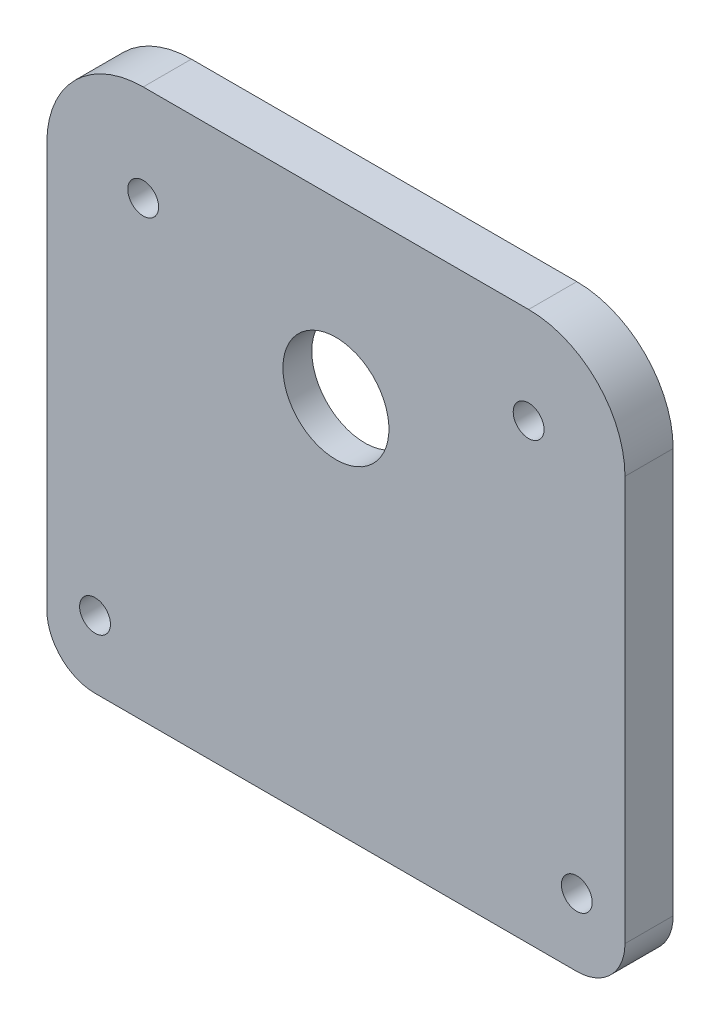
ISO-10303-21;
HEADER;
FILE_DESCRIPTION(('STEP AP214'),'2;1');
FILE_NAME('part.step','',(''),(''),'','','');
FILE_SCHEMA(('AUTOMOTIVE_DESIGN { 1 0 10303 214 1 1 1 1 }'));
ENDSEC;
DATA;
#1=APPLICATION_CONTEXT('core data for automotive mechanical design processes');
#2=APPLICATION_PROTOCOL_DEFINITION('international standard','automotive_design',2000,#1);
#3=PRODUCT_CONTEXT('',#1,'mechanical');
#4=PRODUCT('Part','Part','',(#3));
#5=PRODUCT_RELATED_PRODUCT_CATEGORY('part','',(#4));
#6=PRODUCT_DEFINITION_FORMATION('','',#4);
#7=PRODUCT_DEFINITION_CONTEXT('part definition',#1,'design');
#8=PRODUCT_DEFINITION('design','',#6,#7);
#9=PRODUCT_DEFINITION_SHAPE('','',#8);
#10=(LENGTH_UNIT() NAMED_UNIT(*) SI_UNIT(.MILLI.,.METRE.));
#11=(NAMED_UNIT(*) PLANE_ANGLE_UNIT() SI_UNIT($,.RADIAN.));
#12=(NAMED_UNIT(*) SI_UNIT($,.STERADIAN.) SOLID_ANGLE_UNIT());
#13=UNCERTAINTY_MEASURE_WITH_UNIT(LENGTH_MEASURE(1.E-05),#10,'distance_accuracy_value','');
#14=(GEOMETRIC_REPRESENTATION_CONTEXT(3) GLOBAL_UNCERTAINTY_ASSIGNED_CONTEXT((#13)) GLOBAL_UNIT_ASSIGNED_CONTEXT((#10,
#11,#12)) REPRESENTATION_CONTEXT('',''));
#15=CARTESIAN_POINT('',(0.,0.,0.));
#16=DIRECTION('',(0.,0.,1.));
#17=DIRECTION('',(1.,0.,0.));
#18=AXIS2_PLACEMENT_3D('',#15,#16,#17);
#19=CARTESIAN_POINT('',(0.,0.,5.));
#20=DIRECTION('',(0.,0.,-1.));
#21=DIRECTION('',(-1.,0.,0.));
#22=AXIS2_PLACEMENT_3D('',#19,#20,#21);
#23=PLANE('',#22);
#24=DIRECTION('',(1.,0.,0.));
#25=VECTOR('',#24,1.);
#26=CARTESIAN_POINT('',(0.,32.,5.));
#27=LINE('',#26,#25);
#28=CARTESIAN_POINT('',(-20.,32.,5.));
#29=VERTEX_POINT('',#28);
#30=CARTESIAN_POINT('',(20.,32.,5.));
#31=VERTEX_POINT('',#30);
#32=EDGE_CURVE('E186',#29,#31,#27,.T.);
#33=ORIENTED_EDGE('',*,*,#32,.T.);
#34=CARTESIAN_POINT('',(20.,22.,5.));
#35=DIRECTION('',(0.,0.,-1.));
#36=DIRECTION('',(-1.,0.,0.));
#37=AXIS2_PLACEMENT_3D('',#34,#35,#36);
#38=CIRCLE('',#37,10.);
#39=CARTESIAN_POINT('',(30.,22.,5.));
#40=VERTEX_POINT('',#39);
#41=EDGE_CURVE('E188',#40,#31,#38,.F.);
#42=ORIENTED_EDGE('',*,*,#41,.F.);
#43=DIRECTION('',(0.,-1.,0.));
#44=VECTOR('',#43,1.);
#45=CARTESIAN_POINT('',(30.,-25.,5.));
#46=LINE('',#45,#44);
#47=CARTESIAN_POINT('',(30.,-20.,5.));
#48=VERTEX_POINT('',#47);
#49=EDGE_CURVE('E62',#40,#48,#46,.T.);
#50=ORIENTED_EDGE('',*,*,#49,.T.);
#51=CARTESIAN_POINT('',(25.,-20.,5.));
#52=DIRECTION('',(0.,0.,-1.));
#53=DIRECTION('',(-1.,0.,0.));
#54=AXIS2_PLACEMENT_3D('',#51,#52,#53);
#55=CIRCLE('',#54,5.);
#56=CARTESIAN_POINT('',(25.,-25.,5.));
#57=VERTEX_POINT('',#56);
#58=EDGE_CURVE('E11',#57,#48,#55,.F.);
#59=ORIENTED_EDGE('',*,*,#58,.F.);
#60=DIRECTION('',(-1.,0.,0.));
#61=VECTOR('',#60,1.);
#62=CARTESIAN_POINT('',(-30.,-25.,5.));
#63=LINE('',#62,#61);
#64=CARTESIAN_POINT('',(-25.,-25.,5.));
#65=VERTEX_POINT('',#64);
#66=EDGE_CURVE('E111',#57,#65,#63,.T.);
#67=ORIENTED_EDGE('',*,*,#66,.T.);
#68=CARTESIAN_POINT('',(-25.,-20.,5.));
#69=DIRECTION('',(0.,0.,-1.));
#70=DIRECTION('',(-1.,0.,0.));
#71=AXIS2_PLACEMENT_3D('',#68,#69,#70);
#72=CIRCLE('',#71,5.);
#73=CARTESIAN_POINT('',(-30.,-20.,5.));
#74=VERTEX_POINT('',#73);
#75=EDGE_CURVE('E191',#74,#65,#72,.F.);
#76=ORIENTED_EDGE('',*,*,#75,.F.);
#77=DIRECTION('',(0.,1.,0.));
#78=VECTOR('',#77,1.);
#79=CARTESIAN_POINT('',(-30.,-25.,5.));
#80=LINE('',#79,#78);
#81=CARTESIAN_POINT('',(-30.,22.,5.));
#82=VERTEX_POINT('',#81);
#83=EDGE_CURVE('E184',#74,#82,#80,.T.);
#84=ORIENTED_EDGE('',*,*,#83,.T.);
#85=CARTESIAN_POINT('',(-20.,22.,5.));
#86=DIRECTION('',(0.,0.,-1.));
#87=DIRECTION('',(-1.,0.,0.));
#88=AXIS2_PLACEMENT_3D('',#85,#86,#87);
#89=CIRCLE('',#88,10.);
#90=EDGE_CURVE('E181',#29,#82,#89,.F.);
#91=ORIENTED_EDGE('',*,*,#90,.F.);
#92=EDGE_LOOP('',(#33,#42,#50,#59,#67,#76,#84,#91));
#93=FACE_BOUND('',#92,.T.);
#94=CARTESIAN_POINT('',(-25.,-18.0000000000003,5.));
#95=DIRECTION('',(0.,0.,-1.));
#96=DIRECTION('',(-1.,0.,0.));
#97=AXIS2_PLACEMENT_3D('',#94,#95,#96);
#98=CIRCLE('',#97,1.6);
#99=CARTESIAN_POINT('',(-26.6,-18.0000000000003,5.));
#100=VERTEX_POINT('',#99);
#101=EDGE_CURVE('E178',#100,#100,#98,.F.);
#102=ORIENTED_EDGE('',*,*,#101,.T.);
#103=EDGE_LOOP('',(#102));
#104=FACE_BOUND('',#103,.T.);
#105=CARTESIAN_POINT('',(-20.0000000000001,22.,5.));
#106=DIRECTION('',(0.,0.,-1.));
#107=DIRECTION('',(-1.,0.,0.));
#108=AXIS2_PLACEMENT_3D('',#105,#106,#107);
#109=CIRCLE('',#108,1.6);
#110=CARTESIAN_POINT('',(-21.6000000000001,22.,5.));
#111=VERTEX_POINT('',#110);
#112=EDGE_CURVE('E175',#111,#111,#109,.F.);
#113=ORIENTED_EDGE('',*,*,#112,.T.);
#114=EDGE_LOOP('',(#113));
#115=FACE_BOUND('',#114,.T.);
#116=CARTESIAN_POINT('',(25.,-18.,5.));
#117=DIRECTION('',(0.,0.,-1.));
#118=DIRECTION('',(-1.,0.,0.));
#119=AXIS2_PLACEMENT_3D('',#116,#117,#118);
#120=CIRCLE('',#119,1.6);
#121=CARTESIAN_POINT('',(23.4,-18.,5.));
#122=VERTEX_POINT('',#121);
#123=EDGE_CURVE('E172',#122,#122,#120,.F.);
#124=ORIENTED_EDGE('',*,*,#123,.T.);
#125=EDGE_LOOP('',(#124));
#126=FACE_BOUND('',#125,.T.);
#127=CARTESIAN_POINT('',(19.9999999999999,22.0000000000002,5.));
#128=DIRECTION('',(0.,0.,-1.));
#129=DIRECTION('',(-1.,0.,0.));
#130=AXIS2_PLACEMENT_3D('',#127,#128,#129);
#131=CIRCLE('',#130,1.6);
#132=CARTESIAN_POINT('',(18.3999999999999,22.0000000000002,5.));
#133=VERTEX_POINT('',#132);
#134=EDGE_CURVE('E169',#133,#133,#131,.F.);
#135=ORIENTED_EDGE('',*,*,#134,.T.);
#136=EDGE_LOOP('',(#135));
#137=FACE_BOUND('',#136,.T.);
#138=CARTESIAN_POINT('',(0.,14.,5.));
#139=DIRECTION('',(0.,0.,-1.));
#140=DIRECTION('',(-1.,0.,0.));
#141=AXIS2_PLACEMENT_3D('',#138,#139,#140);
#142=CIRCLE('',#141,15.);
#143=CARTESIAN_POINT('',(-15.,14.,5.));
#144=VERTEX_POINT('',#143);
#145=EDGE_CURVE('E194',#144,#144,#142,.T.);
#146=ORIENTED_EDGE('',*,*,#145,.F.);
#147=EDGE_LOOP('',(#146));
#148=FACE_BOUND('',#147,.T.);
#149=ADVANCED_FACE('F47',(#93,#104,#115,#126,#137,#148),#23,.T.);
#150=CARTESIAN_POINT('',(30.,-25.,5.));
#151=DIRECTION('',(-1.,0.,0.));
#152=DIRECTION('',(0.,0.,1.));
#153=AXIS2_PLACEMENT_3D('',#150,#151,#152);
#154=PLANE('',#153);
#155=ORIENTED_EDGE('',*,*,#49,.F.);
#156=DIRECTION('',(0.,0.,-1.));
#157=VECTOR('',#156,1.);
#158=CARTESIAN_POINT('',(30.,22.,5.));
#159=LINE('',#158,#157);
#160=CARTESIAN_POINT('',(30.,22.,10.));
#161=VERTEX_POINT('',#160);
#162=EDGE_CURVE('E134',#40,#161,#159,.F.);
#163=ORIENTED_EDGE('',*,*,#162,.T.);
#164=DIRECTION('',(0.,1.,0.));
#165=VECTOR('',#164,1.);
#166=CARTESIAN_POINT('',(30.,-25.,10.));
#167=LINE('',#166,#165);
#168=CARTESIAN_POINT('',(30.,-20.,10.));
#169=VERTEX_POINT('',#168);
#170=EDGE_CURVE('E151',#169,#161,#167,.T.);
#171=ORIENTED_EDGE('',*,*,#170,.F.);
#172=DIRECTION('',(0.,0.,-1.));
#173=VECTOR('',#172,1.);
#174=CARTESIAN_POINT('',(30.,-20.,5.));
#175=LINE('',#174,#173);
#176=EDGE_CURVE('E123',#169,#48,#175,.T.);
#177=ORIENTED_EDGE('',*,*,#176,.T.);
#178=EDGE_LOOP('',(#155,#163,#171,#177));
#179=FACE_BOUND('',#178,.T.);
#180=ADVANCED_FACE('F229',(#179),#154,.F.);
#181=CARTESIAN_POINT('',(-30.,-25.,5.));
#182=DIRECTION('',(1.,0.,0.));
#183=DIRECTION('',(0.,0.,-1.));
#184=AXIS2_PLACEMENT_3D('',#181,#182,#183);
#185=PLANE('',#184);
#186=ORIENTED_EDGE('',*,*,#83,.F.);
#187=DIRECTION('',(0.,0.,-1.));
#188=VECTOR('',#187,1.);
#189=CARTESIAN_POINT('',(-30.,-20.,5.));
#190=LINE('',#189,#188);
#191=CARTESIAN_POINT('',(-30.,-20.,10.));
#192=VERTEX_POINT('',#191);
#193=EDGE_CURVE('E129',#74,#192,#190,.F.);
#194=ORIENTED_EDGE('',*,*,#193,.T.);
#195=DIRECTION('',(0.,-1.,0.));
#196=VECTOR('',#195,1.);
#197=CARTESIAN_POINT('',(-30.,-25.,10.));
#198=LINE('',#197,#196);
#199=CARTESIAN_POINT('',(-30.,22.,10.));
#200=VERTEX_POINT('',#199);
#201=EDGE_CURVE('E148',#200,#192,#198,.T.);
#202=ORIENTED_EDGE('',*,*,#201,.F.);
#203=DIRECTION('',(0.,0.,1.));
#204=VECTOR('',#203,1.);
#205=CARTESIAN_POINT('',(-30.,22.,5.));
#206=LINE('',#205,#204);
#207=EDGE_CURVE('E139',#200,#82,#206,.F.);
#208=ORIENTED_EDGE('',*,*,#207,.T.);
#209=EDGE_LOOP('',(#186,#194,#202,#208));
#210=FACE_BOUND('',#209,.T.);
#211=ADVANCED_FACE('F234',(#210),#185,.F.);
#212=CARTESIAN_POINT('',(-30.,-25.,5.));
#213=DIRECTION('',(0.,1.,0.));
#214=DIRECTION('',(0.,0.,1.));
#215=AXIS2_PLACEMENT_3D('',#212,#213,#214);
#216=PLANE('',#215);
#217=ORIENTED_EDGE('',*,*,#66,.F.);
#218=DIRECTION('',(0.,0.,-1.));
#219=VECTOR('',#218,1.);
#220=CARTESIAN_POINT('',(25.,-25.,5.));
#221=LINE('',#220,#219);
#222=CARTESIAN_POINT('',(25.,-25.,10.));
#223=VERTEX_POINT('',#222);
#224=EDGE_CURVE('E69',#57,#223,#221,.F.);
#225=ORIENTED_EDGE('',*,*,#224,.T.);
#226=DIRECTION('',(1.,0.,0.));
#227=VECTOR('',#226,1.);
#228=CARTESIAN_POINT('',(-30.,-25.,10.));
#229=LINE('',#228,#227);
#230=CARTESIAN_POINT('',(-25.,-25.,10.));
#231=VERTEX_POINT('',#230);
#232=EDGE_CURVE('E146',#231,#223,#229,.T.);
#233=ORIENTED_EDGE('',*,*,#232,.F.);
#234=DIRECTION('',(0.,0.,-1.));
#235=VECTOR('',#234,1.);
#236=CARTESIAN_POINT('',(-25.,-25.,5.));
#237=LINE('',#236,#235);
#238=EDGE_CURVE('E119',#231,#65,#237,.T.);
#239=ORIENTED_EDGE('',*,*,#238,.T.);
#240=EDGE_LOOP('',(#217,#225,#233,#239));
#241=FACE_BOUND('',#240,.T.);
#242=ADVANCED_FACE('F117',(#241),#216,.F.);
#243=CARTESIAN_POINT('',(19.9999999999999,22.0000000000002,10.));
#244=DIRECTION('',(0.,0.,-1.));
#245=DIRECTION('',(-1.,0.,0.));
#246=AXIS2_PLACEMENT_3D('',#243,#244,#245);
#247=CYLINDRICAL_SURFACE('',#246,1.6);
#248=CARTESIAN_POINT('',(19.9999999999999,22.0000000000002,10.));
#249=DIRECTION('',(0.,0.,-1.));
#250=DIRECTION('',(-1.,0.,0.));
#251=AXIS2_PLACEMENT_3D('',#248,#249,#250);
#252=CIRCLE('',#251,1.6);
#253=CARTESIAN_POINT('',(18.3999999999999,22.0000000000002,10.));
#254=VERTEX_POINT('',#253);
#255=EDGE_CURVE('E154',#254,#254,#252,.T.);
#256=ORIENTED_EDGE('',*,*,#255,.F.);
#257=EDGE_LOOP('',(#256));
#258=FACE_BOUND('',#257,.T.);
#259=ORIENTED_EDGE('',*,*,#134,.F.);
#260=EDGE_LOOP('',(#259));
#261=FACE_BOUND('',#260,.T.);
#262=ADVANCED_FACE('F241',(#258,#261),#247,.F.);
#263=CARTESIAN_POINT('',(25.,-18.,10.));
#264=DIRECTION('',(0.,0.,-1.));
#265=DIRECTION('',(-1.,0.,0.));
#266=AXIS2_PLACEMENT_3D('',#263,#264,#265);
#267=CYLINDRICAL_SURFACE('',#266,1.6);
#268=CARTESIAN_POINT('',(25.,-18.,10.));
#269=DIRECTION('',(0.,0.,-1.));
#270=DIRECTION('',(-1.,0.,0.));
#271=AXIS2_PLACEMENT_3D('',#268,#269,#270);
#272=CIRCLE('',#271,1.6);
#273=CARTESIAN_POINT('',(23.4,-18.,10.));
#274=VERTEX_POINT('',#273);
#275=EDGE_CURVE('E157',#274,#274,#272,.T.);
#276=ORIENTED_EDGE('',*,*,#275,.F.);
#277=EDGE_LOOP('',(#276));
#278=FACE_BOUND('',#277,.T.);
#279=ORIENTED_EDGE('',*,*,#123,.F.);
#280=EDGE_LOOP('',(#279));
#281=FACE_BOUND('',#280,.T.);
#282=ADVANCED_FACE('F283',(#278,#281),#267,.F.);
#283=CARTESIAN_POINT('',(-20.0000000000001,22.,10.));
#284=DIRECTION('',(0.,0.,-1.));
#285=DIRECTION('',(-1.,0.,0.));
#286=AXIS2_PLACEMENT_3D('',#283,#284,#285);
#287=CYLINDRICAL_SURFACE('',#286,1.6);
#288=CARTESIAN_POINT('',(-20.0000000000001,22.,10.));
#289=DIRECTION('',(0.,0.,-1.));
#290=DIRECTION('',(-1.,0.,0.));
#291=AXIS2_PLACEMENT_3D('',#288,#289,#290);
#292=CIRCLE('',#291,1.6);
#293=CARTESIAN_POINT('',(-21.6000000000001,22.,10.));
#294=VERTEX_POINT('',#293);
#295=EDGE_CURVE('E161',#294,#294,#292,.T.);
#296=ORIENTED_EDGE('',*,*,#295,.F.);
#297=EDGE_LOOP('',(#296));
#298=FACE_BOUND('',#297,.T.);
#299=ORIENTED_EDGE('',*,*,#112,.F.);
#300=EDGE_LOOP('',(#299));
#301=FACE_BOUND('',#300,.T.);
#302=ADVANCED_FACE('F279',(#298,#301),#287,.F.);
#303=CARTESIAN_POINT('',(-25.,-18.0000000000003,10.));
#304=DIRECTION('',(0.,0.,-1.));
#305=DIRECTION('',(-1.,0.,0.));
#306=AXIS2_PLACEMENT_3D('',#303,#304,#305);
#307=CYLINDRICAL_SURFACE('',#306,1.6);
#308=CARTESIAN_POINT('',(-25.,-18.0000000000003,10.));
#309=DIRECTION('',(0.,0.,-1.));
#310=DIRECTION('',(-1.,0.,0.));
#311=AXIS2_PLACEMENT_3D('',#308,#309,#310);
#312=CIRCLE('',#311,1.6);
#313=CARTESIAN_POINT('',(-26.6,-18.0000000000003,10.));
#314=VERTEX_POINT('',#313);
#315=EDGE_CURVE('E158',#314,#314,#312,.T.);
#316=ORIENTED_EDGE('',*,*,#315,.F.);
#317=EDGE_LOOP('',(#316));
#318=FACE_BOUND('',#317,.T.);
#319=ORIENTED_EDGE('',*,*,#101,.F.);
#320=EDGE_LOOP('',(#319));
#321=FACE_BOUND('',#320,.T.);
#322=ADVANCED_FACE('F275',(#318,#321),#307,.F.);
#323=CARTESIAN_POINT('',(0.,32.,0.));
#324=DIRECTION('',(0.,-1.,0.));
#325=DIRECTION('',(0.,0.,-1.));
#326=AXIS2_PLACEMENT_3D('',#323,#324,#325);
#327=PLANE('',#326);
#328=ORIENTED_EDGE('',*,*,#32,.F.);
#329=DIRECTION('',(0.,0.,1.));
#330=VECTOR('',#329,1.);
#331=CARTESIAN_POINT('',(-20.,32.,0.));
#332=LINE('',#331,#330);
#333=CARTESIAN_POINT('',(-20.,32.,10.));
#334=VERTEX_POINT('',#333);
#335=EDGE_CURVE('E144',#29,#334,#332,.T.);
#336=ORIENTED_EDGE('',*,*,#335,.T.);
#337=DIRECTION('',(1.,0.,0.));
#338=VECTOR('',#337,1.);
#339=CARTESIAN_POINT('',(-30.,32.,10.));
#340=LINE('',#339,#338);
#341=CARTESIAN_POINT('',(20.,32.,10.));
#342=VERTEX_POINT('',#341);
#343=EDGE_CURVE('E162',#334,#342,#340,.T.);
#344=ORIENTED_EDGE('',*,*,#343,.T.);
#345=DIRECTION('',(0.,0.,-1.));
#346=VECTOR('',#345,1.);
#347=CARTESIAN_POINT('',(20.,32.,0.));
#348=LINE('',#347,#346);
#349=EDGE_CURVE('E136',#342,#31,#348,.T.);
#350=ORIENTED_EDGE('',*,*,#349,.T.);
#351=EDGE_LOOP('',(#328,#336,#344,#350));
#352=FACE_BOUND('',#351,.T.);
#353=ADVANCED_FACE('F249',(#352),#327,.F.);
#354=CARTESIAN_POINT('',(-20.,22.,0.));
#355=DIRECTION('',(0.,0.,1.));
#356=DIRECTION('',(1.,0.,0.));
#357=AXIS2_PLACEMENT_3D('',#354,#355,#356);
#358=CYLINDRICAL_SURFACE('',#357,10.);
#359=ORIENTED_EDGE('',*,*,#335,.F.);
#360=ORIENTED_EDGE('',*,*,#90,.T.);
#361=ORIENTED_EDGE('',*,*,#207,.F.);
#362=CARTESIAN_POINT('',(-20.,22.,10.));
#363=DIRECTION('',(0.,0.,-1.));
#364=DIRECTION('',(-1.,0.,0.));
#365=AXIS2_PLACEMENT_3D('',#362,#363,#364);
#366=CIRCLE('',#365,10.);
#367=EDGE_CURVE('E142',#334,#200,#366,.F.);
#368=ORIENTED_EDGE('',*,*,#367,.F.);
#369=EDGE_LOOP('',(#359,#360,#361,#368));
#370=FACE_BOUND('',#369,.T.);
#371=ADVANCED_FACE('F245',(#370),#358,.T.);
#372=CARTESIAN_POINT('',(20.,22.,0.));
#373=DIRECTION('',(0.,0.,-1.));
#374=DIRECTION('',(-1.,0.,0.));
#375=AXIS2_PLACEMENT_3D('',#372,#373,#374);
#376=CYLINDRICAL_SURFACE('',#375,10.);
#377=ORIENTED_EDGE('',*,*,#162,.F.);
#378=ORIENTED_EDGE('',*,*,#41,.T.);
#379=ORIENTED_EDGE('',*,*,#349,.F.);
#380=CARTESIAN_POINT('',(20.,22.,10.));
#381=DIRECTION('',(0.,0.,-1.));
#382=DIRECTION('',(-1.,0.,0.));
#383=AXIS2_PLACEMENT_3D('',#380,#381,#382);
#384=CIRCLE('',#383,10.);
#385=EDGE_CURVE('E132',#161,#342,#384,.F.);
#386=ORIENTED_EDGE('',*,*,#385,.F.);
#387=EDGE_LOOP('',(#377,#378,#379,#386));
#388=FACE_BOUND('',#387,.T.);
#389=ADVANCED_FACE('F248',(#388),#376,.T.);
#390=CARTESIAN_POINT('',(-25.,-20.,5.));
#391=DIRECTION('',(0.,0.,-1.));
#392=DIRECTION('',(-1.,0.,0.));
#393=AXIS2_PLACEMENT_3D('',#390,#391,#392);
#394=CYLINDRICAL_SURFACE('',#393,5.);
#395=ORIENTED_EDGE('',*,*,#193,.F.);
#396=ORIENTED_EDGE('',*,*,#75,.T.);
#397=ORIENTED_EDGE('',*,*,#238,.F.);
#398=CARTESIAN_POINT('',(-25.,-20.,10.));
#399=DIRECTION('',(0.,0.,-1.));
#400=DIRECTION('',(-1.,0.,0.));
#401=AXIS2_PLACEMENT_3D('',#398,#399,#400);
#402=CIRCLE('',#401,5.);
#403=EDGE_CURVE('E125',#192,#231,#402,.F.);
#404=ORIENTED_EDGE('',*,*,#403,.F.);
#405=EDGE_LOOP('',(#395,#396,#397,#404));
#406=FACE_BOUND('',#405,.T.);
#407=ADVANCED_FACE('F252',(#406),#394,.T.);
#408=CARTESIAN_POINT('',(25.,-20.,5.));
#409=DIRECTION('',(0.,0.,-1.));
#410=DIRECTION('',(-1.,0.,0.));
#411=AXIS2_PLACEMENT_3D('',#408,#409,#410);
#412=CYLINDRICAL_SURFACE('',#411,5.);
#413=ORIENTED_EDGE('',*,*,#224,.F.);
#414=ORIENTED_EDGE('',*,*,#58,.T.);
#415=ORIENTED_EDGE('',*,*,#176,.F.);
#416=CARTESIAN_POINT('',(25.,-20.,10.));
#417=DIRECTION('',(0.,0.,-1.));
#418=DIRECTION('',(-1.,0.,0.));
#419=AXIS2_PLACEMENT_3D('',#416,#417,#418);
#420=CIRCLE('',#419,5.);
#421=EDGE_CURVE('E55',#223,#169,#420,.F.);
#422=ORIENTED_EDGE('',*,*,#421,.F.);
#423=EDGE_LOOP('',(#413,#414,#415,#422));
#424=FACE_BOUND('',#423,.T.);
#425=ADVANCED_FACE('F49',(#424),#412,.T.);
#426=CARTESIAN_POINT('',(0.,0.,10.));
#427=DIRECTION('',(0.,0.,-1.));
#428=DIRECTION('',(-1.,0.,0.));
#429=AXIS2_PLACEMENT_3D('',#426,#427,#428);
#430=PLANE('',#429);
#431=CARTESIAN_POINT('',(0.,14.,10.));
#432=DIRECTION('',(0.,0.,-1.));
#433=DIRECTION('',(-1.,0.,0.));
#434=AXIS2_PLACEMENT_3D('',#431,#432,#433);
#435=CIRCLE('',#434,5.5);
#436=CARTESIAN_POINT('',(-5.5,14.,10.));
#437=VERTEX_POINT('',#436);
#438=EDGE_CURVE('E197',#437,#437,#435,.T.);
#439=ORIENTED_EDGE('',*,*,#438,.T.);
#440=EDGE_LOOP('',(#439));
#441=FACE_BOUND('',#440,.T.);
#442=ORIENTED_EDGE('',*,*,#315,.T.);
#443=EDGE_LOOP('',(#442));
#444=FACE_BOUND('',#443,.T.);
#445=ORIENTED_EDGE('',*,*,#295,.T.);
#446=EDGE_LOOP('',(#445));
#447=FACE_BOUND('',#446,.T.);
#448=ORIENTED_EDGE('',*,*,#275,.T.);
#449=EDGE_LOOP('',(#448));
#450=FACE_BOUND('',#449,.T.);
#451=ORIENTED_EDGE('',*,*,#255,.T.);
#452=EDGE_LOOP('',(#451));
#453=FACE_BOUND('',#452,.T.);
#454=ORIENTED_EDGE('',*,*,#232,.T.);
#455=ORIENTED_EDGE('',*,*,#421,.T.);
#456=ORIENTED_EDGE('',*,*,#170,.T.);
#457=ORIENTED_EDGE('',*,*,#385,.T.);
#458=ORIENTED_EDGE('',*,*,#343,.F.);
#459=ORIENTED_EDGE('',*,*,#367,.T.);
#460=ORIENTED_EDGE('',*,*,#201,.T.);
#461=ORIENTED_EDGE('',*,*,#403,.T.);
#462=EDGE_LOOP('',(#454,#455,#456,#457,#458,#459,#460,#461));
#463=FACE_BOUND('',#462,.T.);
#464=ADVANCED_FACE('F206',(#441,#444,#447,#450,#453,#463),#430,.F.);
#465=CARTESIAN_POINT('',(0.,0.,7.));
#466=DIRECTION('',(0.,0.,-1.));
#467=DIRECTION('',(-1.,0.,0.));
#468=AXIS2_PLACEMENT_3D('',#465,#466,#467);
#469=PLANE('',#468);
#470=CARTESIAN_POINT('',(0.,14.,7.));
#471=DIRECTION('',(0.,0.,-1.));
#472=DIRECTION('',(-1.,0.,0.));
#473=AXIS2_PLACEMENT_3D('',#470,#471,#472);
#474=CIRCLE('',#473,15.);
#475=CARTESIAN_POINT('',(-15.,14.,7.));
#476=VERTEX_POINT('',#475);
#477=EDGE_CURVE('E120',#476,#476,#474,.T.);
#478=ORIENTED_EDGE('',*,*,#477,.T.);
#479=EDGE_LOOP('',(#478));
#480=FACE_BOUND('',#479,.T.);
#481=CARTESIAN_POINT('',(0.,14.,7.));
#482=DIRECTION('',(0.,0.,-1.));
#483=DIRECTION('',(-1.,0.,0.));
#484=AXIS2_PLACEMENT_3D('',#481,#482,#483);
#485=CIRCLE('',#484,5.5);
#486=CARTESIAN_POINT('',(-5.5,14.,7.));
#487=VERTEX_POINT('',#486);
#488=EDGE_CURVE('E200',#487,#487,#485,.T.);
#489=ORIENTED_EDGE('',*,*,#488,.F.);
#490=EDGE_LOOP('',(#489));
#491=FACE_BOUND('',#490,.T.);
#492=ADVANCED_FACE('F216',(#480,#491),#469,.T.);
#493=CARTESIAN_POINT('',(0.,14.,7.));
#494=DIRECTION('',(0.,0.,-1.));
#495=DIRECTION('',(-1.,0.,0.));
#496=AXIS2_PLACEMENT_3D('',#493,#494,#495);
#497=CYLINDRICAL_SURFACE('',#496,15.);
#498=ORIENTED_EDGE('',*,*,#145,.T.);
#499=EDGE_LOOP('',(#498));
#500=FACE_BOUND('',#499,.T.);
#501=ORIENTED_EDGE('',*,*,#477,.F.);
#502=EDGE_LOOP('',(#501));
#503=FACE_BOUND('',#502,.T.);
#504=ADVANCED_FACE('F212',(#500,#503),#497,.F.);
#505=CARTESIAN_POINT('',(0.,14.,10.));
#506=DIRECTION('',(0.,0.,-1.));
#507=DIRECTION('',(-1.,0.,0.));
#508=AXIS2_PLACEMENT_3D('',#505,#506,#507);
#509=CYLINDRICAL_SURFACE('',#508,5.5);
#510=ORIENTED_EDGE('',*,*,#438,.F.);
#511=EDGE_LOOP('',(#510));
#512=FACE_BOUND('',#511,.T.);
#513=ORIENTED_EDGE('',*,*,#488,.T.);
#514=EDGE_LOOP('',(#513));
#515=FACE_BOUND('',#514,.T.);
#516=ADVANCED_FACE('F209',(#512,#515),#509,.F.);
#517=CLOSED_SHELL('',(#149,#180,#211,#242,#262,#282,#302,#322,#353,#371,#389,#407,#425,#464,
#492,#504,#516));
#518=MANIFOLD_SOLID_BREP('B2',#517);
#519=ADVANCED_BREP_SHAPE_REPRESENTATION('',(#18,#518),#14);
#520=SHAPE_DEFINITION_REPRESENTATION(#9,#519);
ENDSEC;
END-ISO-10303-21;
